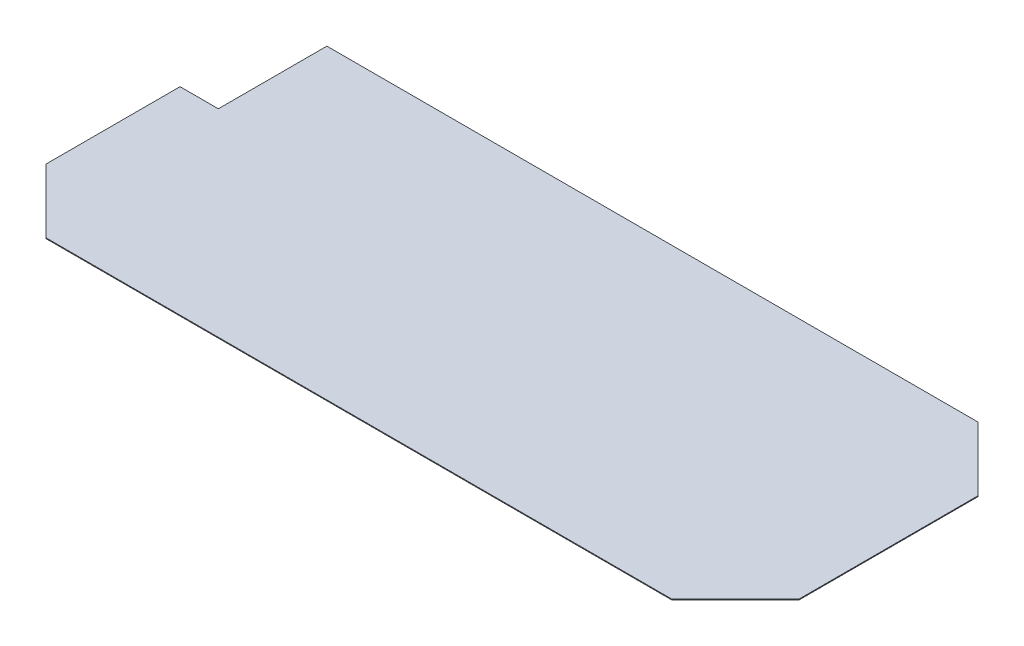
ISO-10303-21;
HEADER;
FILE_DESCRIPTION(('STEP AP214'),'2;1');
FILE_NAME('part.step','',(''),(''),'','','');
FILE_SCHEMA(('AUTOMOTIVE_DESIGN { 1 0 10303 214 1 1 1 1 }'));
ENDSEC;
DATA;
#1=APPLICATION_CONTEXT('core data for automotive mechanical design processes');
#2=APPLICATION_PROTOCOL_DEFINITION('international standard','automotive_design',2000,#1);
#3=PRODUCT_CONTEXT('',#1,'mechanical');
#4=PRODUCT('Part','Part','',(#3));
#5=PRODUCT_RELATED_PRODUCT_CATEGORY('part','',(#4));
#6=PRODUCT_DEFINITION_FORMATION('','',#4);
#7=PRODUCT_DEFINITION_CONTEXT('part definition',#1,'design');
#8=PRODUCT_DEFINITION('design','',#6,#7);
#9=PRODUCT_DEFINITION_SHAPE('','',#8);
#10=(LENGTH_UNIT() NAMED_UNIT(*) SI_UNIT(.MILLI.,.METRE.));
#11=(NAMED_UNIT(*) PLANE_ANGLE_UNIT() SI_UNIT($,.RADIAN.));
#12=(NAMED_UNIT(*) SI_UNIT($,.STERADIAN.) SOLID_ANGLE_UNIT());
#13=UNCERTAINTY_MEASURE_WITH_UNIT(LENGTH_MEASURE(1.E-05),#10,'distance_accuracy_value','');
#14=(GEOMETRIC_REPRESENTATION_CONTEXT(3) GLOBAL_UNCERTAINTY_ASSIGNED_CONTEXT((#13)) GLOBAL_UNIT_ASSIGNED_CONTEXT((#10,
#11,#12)) REPRESENTATION_CONTEXT('',''));
#15=CARTESIAN_POINT('',(0.,0.,0.));
#16=DIRECTION('',(0.,0.,1.));
#17=DIRECTION('',(1.,0.,0.));
#18=AXIS2_PLACEMENT_3D('',#15,#16,#17);
#19=CARTESIAN_POINT('',(127.,1.5875,0.));
#20=DIRECTION('',(0.707106781186548,0.,-0.707106781186548));
#21=DIRECTION('',(-0.707106781186548,0.,-0.707106781186548));
#22=AXIS2_PLACEMENT_3D('',#19,#20,#21);
#23=PLANE('',#22);
#24=DIRECTION('',(0.707106781186548,0.,0.707106781186548));
#25=VECTOR('',#24,1.);
#26=CARTESIAN_POINT('',(127.,0.,0.));
#27=LINE('',#26,#25);
#28=CARTESIAN_POINT('',(0.,0.,-127.));
#29=VERTEX_POINT('',#28);
#30=CARTESIAN_POINT('',(127.,0.,0.));
#31=VERTEX_POINT('',#30);
#32=EDGE_CURVE('E136',#29,#31,#27,.T.);
#33=ORIENTED_EDGE('',*,*,#32,.T.);
#34=DIRECTION('',(0.,-1.,0.));
#35=VECTOR('',#34,1.);
#36=CARTESIAN_POINT('',(127.,1.5875,0.));
#37=LINE('',#36,#35);
#38=CARTESIAN_POINT('',(127.,1.5875,0.));
#39=VERTEX_POINT('',#38);
#40=EDGE_CURVE('E11',#39,#31,#37,.T.);
#41=ORIENTED_EDGE('',*,*,#40,.F.);
#42=DIRECTION('',(0.707106781186548,0.,0.707106781186548));
#43=VECTOR('',#42,1.);
#44=CARTESIAN_POINT('',(127.,1.5875,0.));
#45=LINE('',#44,#43);
#46=CARTESIAN_POINT('',(0.,1.5875,-127.));
#47=VERTEX_POINT('',#46);
#48=EDGE_CURVE('E152',#47,#39,#45,.T.);
#49=ORIENTED_EDGE('',*,*,#48,.F.);
#50=DIRECTION('',(0.,-1.,0.));
#51=VECTOR('',#50,1.);
#52=CARTESIAN_POINT('',(0.,1.5875,-127.));
#53=LINE('',#52,#51);
#54=EDGE_CURVE('E132',#47,#29,#53,.T.);
#55=ORIENTED_EDGE('',*,*,#54,.T.);
#56=EDGE_LOOP('',(#33,#41,#49,#55));
#57=FACE_BOUND('',#56,.T.);
#58=ADVANCED_FACE('F34',(#57),#23,.F.);
#59=CARTESIAN_POINT('',(127.,1.5875,0.));
#60=DIRECTION('',(0.,0.,-1.));
#61=DIRECTION('',(-1.,0.,0.));
#62=AXIS2_PLACEMENT_3D('',#59,#60,#61);
#63=PLANE('',#62);
#64=DIRECTION('',(1.,0.,0.));
#65=VECTOR('',#64,1.);
#66=CARTESIAN_POINT('',(127.,0.,0.));
#67=LINE('',#66,#65);
#68=CARTESIAN_POINT('',(1371.6,0.,-1.65181239196231E-13));
#69=VERTEX_POINT('',#68);
#70=EDGE_CURVE('E139',#31,#69,#67,.T.);
#71=ORIENTED_EDGE('',*,*,#70,.T.);
#72=DIRECTION('',(0.,-1.,0.));
#73=VECTOR('',#72,1.);
#74=CARTESIAN_POINT('',(1371.6,1.5875,-1.65181239196231E-13));
#75=LINE('',#74,#73);
#76=CARTESIAN_POINT('',(1371.6,1.5875,-1.65181239196231E-13));
#77=VERTEX_POINT('',#76);
#78=EDGE_CURVE('E42',#77,#69,#75,.T.);
#79=ORIENTED_EDGE('',*,*,#78,.F.);
#80=DIRECTION('',(1.,0.,0.));
#81=VECTOR('',#80,1.);
#82=CARTESIAN_POINT('',(127.,1.5875,0.));
#83=LINE('',#82,#81);
#84=EDGE_CURVE('E96',#39,#77,#83,.T.);
#85=ORIENTED_EDGE('',*,*,#84,.F.);
#86=ORIENTED_EDGE('',*,*,#40,.T.);
#87=EDGE_LOOP('',(#71,#79,#85,#86));
#88=FACE_BOUND('',#87,.T.);
#89=ADVANCED_FACE('F195',(#88),#63,.F.);
#90=CARTESIAN_POINT('',(1498.6,1.5875,-127.));
#91=DIRECTION('',(-0.707106781186547,0.,-0.707106781186548));
#92=DIRECTION('',(-0.707106781186548,0.,0.707106781186547));
#93=AXIS2_PLACEMENT_3D('',#90,#91,#92);
#94=PLANE('',#93);
#95=DIRECTION('',(0.707106781186548,0.,-0.707106781186547));
#96=VECTOR('',#95,1.);
#97=CARTESIAN_POINT('',(1498.6,0.,-127.));
#98=LINE('',#97,#96);
#99=CARTESIAN_POINT('',(1498.6,0.,-127.));
#100=VERTEX_POINT('',#99);
#101=EDGE_CURVE('E141',#69,#100,#98,.T.);
#102=ORIENTED_EDGE('',*,*,#101,.T.);
#103=DIRECTION('',(0.,-1.,0.));
#104=VECTOR('',#103,1.);
#105=CARTESIAN_POINT('',(1498.6,1.5875,-127.));
#106=LINE('',#105,#104);
#107=CARTESIAN_POINT('',(1498.6,1.5875,-127.));
#108=VERTEX_POINT('',#107);
#109=EDGE_CURVE('E162',#108,#100,#106,.T.);
#110=ORIENTED_EDGE('',*,*,#109,.F.);
#111=DIRECTION('',(0.707106781186548,0.,-0.707106781186547));
#112=VECTOR('',#111,1.);
#113=CARTESIAN_POINT('',(1498.6,1.5875,-127.));
#114=LINE('',#113,#112);
#115=EDGE_CURVE('E170',#77,#108,#114,.T.);
#116=ORIENTED_EDGE('',*,*,#115,.F.);
#117=ORIENTED_EDGE('',*,*,#78,.T.);
#118=EDGE_LOOP('',(#102,#110,#116,#117));
#119=FACE_BOUND('',#118,.T.);
#120=ADVANCED_FACE('F168',(#119),#94,.F.);
#121=CARTESIAN_POINT('',(1498.6,1.5875,-127.));
#122=DIRECTION('',(-1.,0.,0.));
#123=DIRECTION('',(0.,0.,1.));
#124=AXIS2_PLACEMENT_3D('',#121,#122,#123);
#125=PLANE('',#124);
#126=DIRECTION('',(0.,0.,-1.));
#127=VECTOR('',#126,1.);
#128=CARTESIAN_POINT('',(1498.6,0.,-127.));
#129=LINE('',#128,#127);
#130=CARTESIAN_POINT('',(1498.6,0.,-482.6));
#131=VERTEX_POINT('',#130);
#132=EDGE_CURVE('E143',#100,#131,#129,.T.);
#133=ORIENTED_EDGE('',*,*,#132,.T.);
#134=DIRECTION('',(0.,-1.,0.));
#135=VECTOR('',#134,1.);
#136=CARTESIAN_POINT('',(1498.6,1.5875,-482.6));
#137=LINE('',#136,#135);
#138=CARTESIAN_POINT('',(1498.6,1.5875,-482.6));
#139=VERTEX_POINT('',#138);
#140=EDGE_CURVE('E159',#139,#131,#137,.T.);
#141=ORIENTED_EDGE('',*,*,#140,.F.);
#142=DIRECTION('',(0.,0.,-1.));
#143=VECTOR('',#142,1.);
#144=CARTESIAN_POINT('',(1498.6,1.5875,-127.));
#145=LINE('',#144,#143);
#146=EDGE_CURVE('E186',#108,#139,#145,.T.);
#147=ORIENTED_EDGE('',*,*,#146,.F.);
#148=ORIENTED_EDGE('',*,*,#109,.T.);
#149=EDGE_LOOP('',(#133,#141,#147,#148));
#150=FACE_BOUND('',#149,.T.);
#151=ADVANCED_FACE('F179',(#150),#125,.F.);
#152=CARTESIAN_POINT('',(1498.6,1.5875,-482.6));
#153=DIRECTION('',(-0.707106781186548,0.,0.707106781186547));
#154=DIRECTION('',(0.707106781186547,0.,0.707106781186548));
#155=AXIS2_PLACEMENT_3D('',#152,#153,#154);
#156=PLANE('',#155);
#157=DIRECTION('',(-0.707106781186547,0.,-0.707106781186548));
#158=VECTOR('',#157,1.);
#159=CARTESIAN_POINT('',(1498.6,0.,-482.6));
#160=LINE('',#159,#158);
#161=CARTESIAN_POINT('',(1371.6,0.,-609.6));
#162=VERTEX_POINT('',#161);
#163=EDGE_CURVE('E145',#131,#162,#160,.T.);
#164=ORIENTED_EDGE('',*,*,#163,.T.);
#165=DIRECTION('',(0.,-1.,0.));
#166=VECTOR('',#165,1.);
#167=CARTESIAN_POINT('',(1371.6,1.5875,-609.6));
#168=LINE('',#167,#166);
#169=CARTESIAN_POINT('',(1371.6,1.5875,-609.6));
#170=VERTEX_POINT('',#169);
#171=EDGE_CURVE('E156',#170,#162,#168,.T.);
#172=ORIENTED_EDGE('',*,*,#171,.F.);
#173=DIRECTION('',(-0.707106781186547,0.,-0.707106781186548));
#174=VECTOR('',#173,1.);
#175=CARTESIAN_POINT('',(1498.6,1.5875,-482.6));
#176=LINE('',#175,#174);
#177=EDGE_CURVE('E185',#139,#170,#176,.T.);
#178=ORIENTED_EDGE('',*,*,#177,.F.);
#179=ORIENTED_EDGE('',*,*,#140,.T.);
#180=EDGE_LOOP('',(#164,#172,#178,#179));
#181=FACE_BOUND('',#180,.T.);
#182=ADVANCED_FACE('F183',(#181),#156,.F.);
#183=CARTESIAN_POINT('',(76.2,1.5875,-609.6));
#184=DIRECTION('',(0.,0.,1.));
#185=DIRECTION('',(1.,0.,0.));
#186=AXIS2_PLACEMENT_3D('',#183,#184,#185);
#187=PLANE('',#186);
#188=DIRECTION('',(-1.,0.,0.));
#189=VECTOR('',#188,1.);
#190=CARTESIAN_POINT('',(76.2,0.,-609.6));
#191=LINE('',#190,#189);
#192=CARTESIAN_POINT('',(76.2,0.,-609.6));
#193=VERTEX_POINT('',#192);
#194=EDGE_CURVE('E147',#162,#193,#191,.T.);
#195=ORIENTED_EDGE('',*,*,#194,.T.);
#196=DIRECTION('',(0.,-1.,0.));
#197=VECTOR('',#196,1.);
#198=CARTESIAN_POINT('',(76.2,1.5875,-609.6));
#199=LINE('',#198,#197);
#200=CARTESIAN_POINT('',(76.2,1.5875,-609.6));
#201=VERTEX_POINT('',#200);
#202=EDGE_CURVE('E127',#201,#193,#199,.T.);
#203=ORIENTED_EDGE('',*,*,#202,.F.);
#204=DIRECTION('',(-1.,0.,0.));
#205=VECTOR('',#204,1.);
#206=CARTESIAN_POINT('',(76.2,1.5875,-609.6));
#207=LINE('',#206,#205);
#208=EDGE_CURVE('E118',#170,#201,#207,.T.);
#209=ORIENTED_EDGE('',*,*,#208,.F.);
#210=ORIENTED_EDGE('',*,*,#171,.T.);
#211=EDGE_LOOP('',(#195,#203,#209,#210));
#212=FACE_BOUND('',#211,.T.);
#213=ADVANCED_FACE('F207',(#212),#187,.F.);
#214=CARTESIAN_POINT('',(76.2,1.5875,-609.6));
#215=DIRECTION('',(1.,0.,0.));
#216=DIRECTION('',(0.,0.,-1.));
#217=AXIS2_PLACEMENT_3D('',#214,#215,#216);
#218=PLANE('',#217);
#219=DIRECTION('',(0.,0.,1.));
#220=VECTOR('',#219,1.);
#221=CARTESIAN_POINT('',(76.2,0.,-609.6));
#222=LINE('',#221,#220);
#223=CARTESIAN_POINT('',(76.2000000000001,0.,-393.7));
#224=VERTEX_POINT('',#223);
#225=EDGE_CURVE('E126',#193,#224,#222,.T.);
#226=ORIENTED_EDGE('',*,*,#225,.T.);
#227=DIRECTION('',(0.,-1.,0.));
#228=VECTOR('',#227,1.);
#229=CARTESIAN_POINT('',(76.2000000000001,1.5875,-393.7));
#230=LINE('',#229,#228);
#231=CARTESIAN_POINT('',(76.2000000000001,1.5875,-393.7));
#232=VERTEX_POINT('',#231);
#233=EDGE_CURVE('E123',#232,#224,#230,.T.);
#234=ORIENTED_EDGE('',*,*,#233,.F.);
#235=DIRECTION('',(0.,0.,1.));
#236=VECTOR('',#235,1.);
#237=CARTESIAN_POINT('',(76.2,1.5875,-609.6));
#238=LINE('',#237,#236);
#239=EDGE_CURVE('E112',#201,#232,#238,.T.);
#240=ORIENTED_EDGE('',*,*,#239,.F.);
#241=ORIENTED_EDGE('',*,*,#202,.T.);
#242=EDGE_LOOP('',(#226,#234,#240,#241));
#243=FACE_BOUND('',#242,.T.);
#244=ADVANCED_FACE('F124',(#243),#218,.F.);
#245=CARTESIAN_POINT('',(0.,1.5875,-393.7));
#246=DIRECTION('',(0.,0.,1.));
#247=DIRECTION('',(1.,0.,0.));
#248=AXIS2_PLACEMENT_3D('',#245,#246,#247);
#249=PLANE('',#248);
#250=DIRECTION('',(-1.,0.,0.));
#251=VECTOR('',#250,1.);
#252=CARTESIAN_POINT('',(0.,0.,-393.7));
#253=LINE('',#252,#251);
#254=CARTESIAN_POINT('',(0.,0.,-393.7));
#255=VERTEX_POINT('',#254);
#256=EDGE_CURVE('E82',#224,#255,#253,.T.);
#257=ORIENTED_EDGE('',*,*,#256,.T.);
#258=DIRECTION('',(0.,-1.,0.));
#259=VECTOR('',#258,1.);
#260=CARTESIAN_POINT('',(0.,1.5875,-393.7));
#261=LINE('',#260,#259);
#262=CARTESIAN_POINT('',(0.,1.5875,-393.7));
#263=VERTEX_POINT('',#262);
#264=EDGE_CURVE('E128',#263,#255,#261,.T.);
#265=ORIENTED_EDGE('',*,*,#264,.F.);
#266=DIRECTION('',(-1.,0.,0.));
#267=VECTOR('',#266,1.);
#268=CARTESIAN_POINT('',(0.,1.5875,-393.7));
#269=LINE('',#268,#267);
#270=EDGE_CURVE('E116',#232,#263,#269,.T.);
#271=ORIENTED_EDGE('',*,*,#270,.F.);
#272=ORIENTED_EDGE('',*,*,#233,.T.);
#273=EDGE_LOOP('',(#257,#265,#271,#272));
#274=FACE_BOUND('',#273,.T.);
#275=ADVANCED_FACE('F130',(#274),#249,.F.);
#276=CARTESIAN_POINT('',(0.,1.5875,-127.));
#277=DIRECTION('',(1.,0.,0.));
#278=DIRECTION('',(0.,0.,-1.));
#279=AXIS2_PLACEMENT_3D('',#276,#277,#278);
#280=PLANE('',#279);
#281=DIRECTION('',(0.,0.,1.));
#282=VECTOR('',#281,1.);
#283=CARTESIAN_POINT('',(0.,0.,-127.));
#284=LINE('',#283,#282);
#285=EDGE_CURVE('E88',#255,#29,#284,.T.);
#286=ORIENTED_EDGE('',*,*,#285,.T.);
#287=ORIENTED_EDGE('',*,*,#54,.F.);
#288=DIRECTION('',(0.,0.,1.));
#289=VECTOR('',#288,1.);
#290=CARTESIAN_POINT('',(0.,1.5875,-127.));
#291=LINE('',#290,#289);
#292=EDGE_CURVE('E50',#263,#47,#291,.T.);
#293=ORIENTED_EDGE('',*,*,#292,.F.);
#294=ORIENTED_EDGE('',*,*,#264,.T.);
#295=EDGE_LOOP('',(#286,#287,#293,#294));
#296=FACE_BOUND('',#295,.T.);
#297=ADVANCED_FACE('F215',(#296),#280,.F.);
#298=CARTESIAN_POINT('',(0.,1.5875,0.));
#299=DIRECTION('',(0.,1.,0.));
#300=DIRECTION('',(0.,0.,1.));
#301=AXIS2_PLACEMENT_3D('',#298,#299,#300);
#302=PLANE('',#301);
#303=ORIENTED_EDGE('',*,*,#48,.T.);
#304=ORIENTED_EDGE('',*,*,#84,.T.);
#305=ORIENTED_EDGE('',*,*,#115,.T.);
#306=ORIENTED_EDGE('',*,*,#146,.T.);
#307=ORIENTED_EDGE('',*,*,#177,.T.);
#308=ORIENTED_EDGE('',*,*,#208,.T.);
#309=ORIENTED_EDGE('',*,*,#239,.T.);
#310=ORIENTED_EDGE('',*,*,#270,.T.);
#311=ORIENTED_EDGE('',*,*,#292,.T.);
#312=EDGE_LOOP('',(#303,#304,#305,#306,#307,#308,#309,#310,#311));
#313=FACE_BOUND('',#312,.T.);
#314=ADVANCED_FACE('F114',(#313),#302,.T.);
#315=CARTESIAN_POINT('',(0.,0.,0.));
#316=DIRECTION('',(0.,1.,0.));
#317=DIRECTION('',(0.,0.,1.));
#318=AXIS2_PLACEMENT_3D('',#315,#316,#317);
#319=PLANE('',#318);
#320=ORIENTED_EDGE('',*,*,#32,.F.);
#321=ORIENTED_EDGE('',*,*,#285,.F.);
#322=ORIENTED_EDGE('',*,*,#256,.F.);
#323=ORIENTED_EDGE('',*,*,#225,.F.);
#324=ORIENTED_EDGE('',*,*,#194,.F.);
#325=ORIENTED_EDGE('',*,*,#163,.F.);
#326=ORIENTED_EDGE('',*,*,#132,.F.);
#327=ORIENTED_EDGE('',*,*,#101,.F.);
#328=ORIENTED_EDGE('',*,*,#70,.F.);
#329=EDGE_LOOP('',(#320,#321,#322,#323,#324,#325,#326,#327,#328));
#330=FACE_BOUND('',#329,.T.);
#331=ADVANCED_FACE('F174',(#330),#319,.F.);
#332=CLOSED_SHELL('',(#58,#89,#120,#151,#182,#213,#244,#275,#297,#314,#331));
#333=MANIFOLD_SOLID_BREP('B2',#332);
#334=ADVANCED_BREP_SHAPE_REPRESENTATION('',(#18,#333),#14);
#335=SHAPE_DEFINITION_REPRESENTATION(#9,#334);
ENDSEC;
END-ISO-10303-21;
